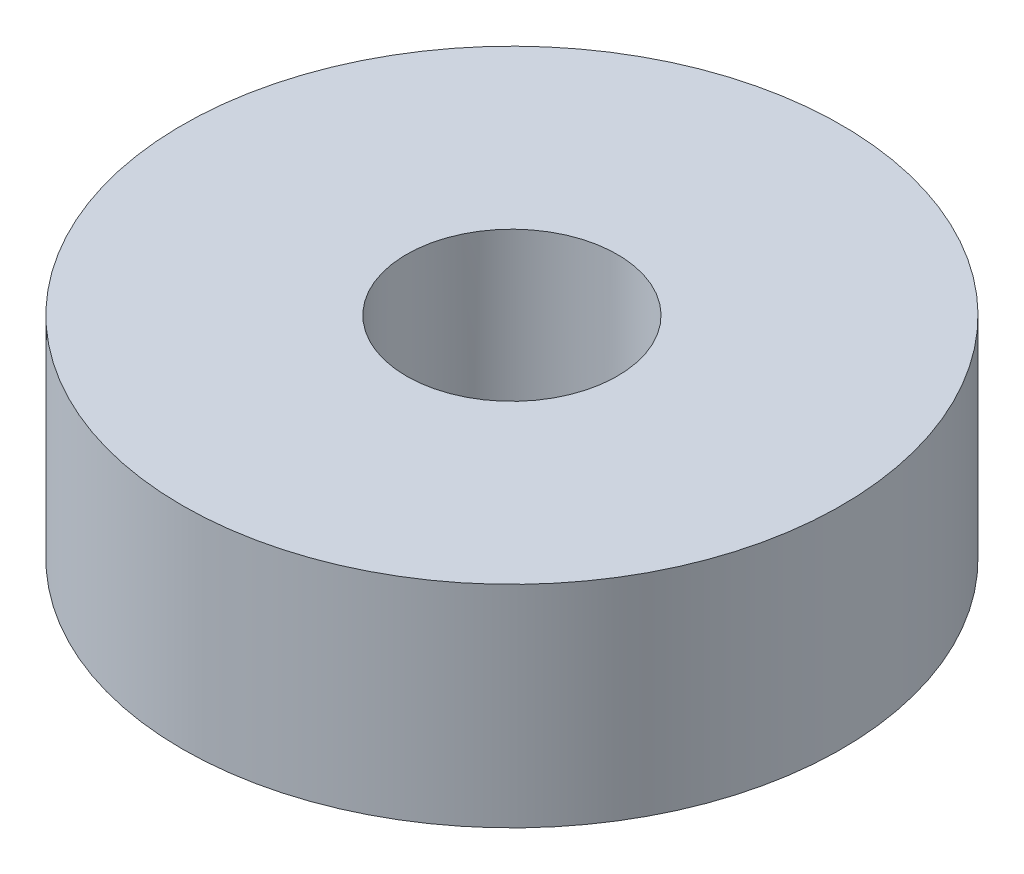
ISO-10303-21;
HEADER;
FILE_DESCRIPTION(('STEP AP214'),'2;1');
FILE_NAME('part.step','',(''),(''),'','','');
FILE_SCHEMA(('AUTOMOTIVE_DESIGN { 1 0 10303 214 1 1 1 1 }'));
ENDSEC;
DATA;
#1=APPLICATION_CONTEXT('core data for automotive mechanical design processes');
#2=APPLICATION_PROTOCOL_DEFINITION('international standard','automotive_design',2000,#1);
#3=PRODUCT_CONTEXT('',#1,'mechanical');
#4=PRODUCT('Part','Part','',(#3));
#5=PRODUCT_RELATED_PRODUCT_CATEGORY('part','',(#4));
#6=PRODUCT_DEFINITION_FORMATION('','',#4);
#7=PRODUCT_DEFINITION_CONTEXT('part definition',#1,'design');
#8=PRODUCT_DEFINITION('design','',#6,#7);
#9=PRODUCT_DEFINITION_SHAPE('','',#8);
#10=(LENGTH_UNIT() NAMED_UNIT(*) SI_UNIT(.MILLI.,.METRE.));
#11=(NAMED_UNIT(*) PLANE_ANGLE_UNIT() SI_UNIT($,.RADIAN.));
#12=(NAMED_UNIT(*) SI_UNIT($,.STERADIAN.) SOLID_ANGLE_UNIT());
#13=UNCERTAINTY_MEASURE_WITH_UNIT(LENGTH_MEASURE(1.E-05),#10,'distance_accuracy_value','');
#14=(GEOMETRIC_REPRESENTATION_CONTEXT(3) GLOBAL_UNCERTAINTY_ASSIGNED_CONTEXT((#13)) GLOBAL_UNIT_ASSIGNED_CONTEXT((#10,
#11,#12)) REPRESENTATION_CONTEXT('',''));
#15=CARTESIAN_POINT('',(0.,0.,0.));
#16=DIRECTION('',(0.,0.,1.));
#17=DIRECTION('',(1.,0.,0.));
#18=AXIS2_PLACEMENT_3D('',#15,#16,#17);
#19=CARTESIAN_POINT('',(0.,-2.,0.));
#20=DIRECTION('',(0.,1.,0.));
#21=DIRECTION('',(0.,0.,1.));
#22=AXIS2_PLACEMENT_3D('',#19,#20,#21);
#23=CYLINDRICAL_SURFACE('',#22,4.);
#24=CARTESIAN_POINT('',(0.,6.,0.));
#25=DIRECTION('',(0.,1.,0.));
#26=DIRECTION('',(0.,0.,1.));
#27=AXIS2_PLACEMENT_3D('',#24,#25,#26);
#28=CIRCLE('',#27,4.);
#29=CARTESIAN_POINT('',(0.,6.,4.));
#30=VERTEX_POINT('',#29);
#31=EDGE_CURVE('E171',#30,#30,#28,.T.);
#32=ORIENTED_EDGE('',*,*,#31,.T.);
#33=EDGE_LOOP('',(#32));
#34=FACE_BOUND('',#33,.T.);
#35=CARTESIAN_POINT('',(0.,0.,0.));
#36=DIRECTION('',(0.,-1.,0.));
#37=DIRECTION('',(0.,0.,-1.));
#38=AXIS2_PLACEMENT_3D('',#35,#36,#37);
#39=CIRCLE('',#38,4.);
#40=CARTESIAN_POINT('',(0.,0.,-4.));
#41=VERTEX_POINT('',#40);
#42=EDGE_CURVE('E49',#41,#41,#39,.F.);
#43=ORIENTED_EDGE('',*,*,#42,.F.);
#44=EDGE_LOOP('',(#43));
#45=FACE_BOUND('',#44,.T.);
#46=ADVANCED_FACE('F45',(#34,#45),#23,.F.);
#47=CARTESIAN_POINT('',(0.,-2.,0.));
#48=DIRECTION('',(0.,1.,0.));
#49=DIRECTION('',(0.,0.,1.));
#50=AXIS2_PLACEMENT_3D('',#47,#48,#49);
#51=CYLINDRICAL_SURFACE('',#50,12.5);
#52=CARTESIAN_POINT('',(0.,-2.,0.));
#53=DIRECTION('',(0.,1.,0.));
#54=DIRECTION('',(0.,0.,1.));
#55=AXIS2_PLACEMENT_3D('',#52,#53,#54);
#56=CIRCLE('',#55,12.5);
#57=CARTESIAN_POINT('',(0.,-2.,12.5));
#58=VERTEX_POINT('',#57);
#59=EDGE_CURVE('E11',#58,#58,#56,.T.);
#60=ORIENTED_EDGE('',*,*,#59,.T.);
#61=EDGE_LOOP('',(#60));
#62=FACE_BOUND('',#61,.T.);
#63=CARTESIAN_POINT('',(0.,6.,0.));
#64=DIRECTION('',(0.,1.,0.));
#65=DIRECTION('',(0.,0.,1.));
#66=AXIS2_PLACEMENT_3D('',#63,#64,#65);
#67=CIRCLE('',#66,12.5);
#68=CARTESIAN_POINT('',(0.,6.,12.5));
#69=VERTEX_POINT('',#68);
#70=EDGE_CURVE('E55',#69,#69,#67,.T.);
#71=ORIENTED_EDGE('',*,*,#70,.F.);
#72=EDGE_LOOP('',(#71));
#73=FACE_BOUND('',#72,.T.);
#74=ADVANCED_FACE('F47',(#62,#73),#51,.T.);
#75=CARTESIAN_POINT('',(0.,-2.,0.));
#76=DIRECTION('',(0.,1.,0.));
#77=DIRECTION('',(0.,0.,1.));
#78=AXIS2_PLACEMENT_3D('',#75,#76,#77);
#79=PLANE('',#78);
#80=DIRECTION('',(-0.500000000000001,0.,0.866025403784438));
#81=VECTOR('',#80,1.);
#82=CARTESIAN_POINT('',(9.85829335034782,-2.,0.));
#83=LINE('',#82,#81);
#84=CARTESIAN_POINT('',(9.85829335034782,-2.,0.));
#85=VERTEX_POINT('',#84);
#86=CARTESIAN_POINT('',(4.92914667517389,-2.,8.53753247936043));
#87=VERTEX_POINT('',#86);
#88=EDGE_CURVE('E143',#85,#87,#83,.T.);
#89=ORIENTED_EDGE('',*,*,#88,.F.);
#90=DIRECTION('',(0.499999999999995,0.,0.866025403784441));
#91=VECTOR('',#90,1.);
#92=CARTESIAN_POINT('',(4.92914667517401,-2.,-8.53753247936036));
#93=LINE('',#92,#91);
#94=CARTESIAN_POINT('',(4.92914667517401,-2.,-8.53753247936036));
#95=VERTEX_POINT('',#94);
#96=EDGE_CURVE('E62',#95,#85,#93,.T.);
#97=ORIENTED_EDGE('',*,*,#96,.F.);
#98=DIRECTION('',(1.,0.,0.));
#99=VECTOR('',#98,1.);
#100=CARTESIAN_POINT('',(-4.92914667517383,-2.,-8.53753247936046));
#101=LINE('',#100,#99);
#102=CARTESIAN_POINT('',(-4.92914667517383,-2.,-8.53753247936046));
#103=VERTEX_POINT('',#102);
#104=EDGE_CURVE('E156',#103,#95,#101,.T.);
#105=ORIENTED_EDGE('',*,*,#104,.F.);
#106=DIRECTION('',(0.500000000000007,0.,-0.866025403784435));
#107=VECTOR('',#106,1.);
#108=CARTESIAN_POINT('',(-9.85829335034782,-2.,0.));
#109=LINE('',#108,#107);
#110=CARTESIAN_POINT('',(-9.85829335034782,-2.,0.));
#111=VERTEX_POINT('',#110);
#112=EDGE_CURVE('E153',#111,#103,#109,.T.);
#113=ORIENTED_EDGE('',*,*,#112,.F.);
#114=DIRECTION('',(-0.499999999999995,0.,-0.866025403784441));
#115=VECTOR('',#114,1.);
#116=CARTESIAN_POINT('',(-4.92914667517395,-2.,8.53753247936039));
#117=LINE('',#116,#115);
#118=CARTESIAN_POINT('',(-4.92914667517395,-2.,8.53753247936039));
#119=VERTEX_POINT('',#118);
#120=EDGE_CURVE('E110',#119,#111,#117,.T.);
#121=ORIENTED_EDGE('',*,*,#120,.F.);
#122=DIRECTION('',(-1.,0.,0.));
#123=VECTOR('',#122,1.);
#124=CARTESIAN_POINT('',(4.92914667517389,-2.,8.53753247936043));
#125=LINE('',#124,#123);
#126=EDGE_CURVE('E147',#87,#119,#125,.T.);
#127=ORIENTED_EDGE('',*,*,#126,.F.);
#128=EDGE_LOOP('',(#89,#97,#105,#113,#121,#127));
#129=FACE_BOUND('',#128,.T.);
#130=ORIENTED_EDGE('',*,*,#59,.F.);
#131=EDGE_LOOP('',(#130));
#132=FACE_BOUND('',#131,.T.);
#133=ADVANCED_FACE('F183',(#129,#132),#79,.F.);
#134=CARTESIAN_POINT('',(0.,6.,0.));
#135=DIRECTION('',(0.,1.,0.));
#136=DIRECTION('',(0.,0.,1.));
#137=AXIS2_PLACEMENT_3D('',#134,#135,#136);
#138=PLANE('',#137);
#139=ORIENTED_EDGE('',*,*,#70,.T.);
#140=EDGE_LOOP('',(#139));
#141=FACE_BOUND('',#140,.T.);
#142=ORIENTED_EDGE('',*,*,#31,.F.);
#143=EDGE_LOOP('',(#142));
#144=FACE_BOUND('',#143,.T.);
#145=ADVANCED_FACE('F179',(#141,#144),#138,.T.);
#146=CARTESIAN_POINT('',(0.,0.,0.));
#147=DIRECTION('',(0.,-1.,0.));
#148=DIRECTION('',(0.,0.,-1.));
#149=AXIS2_PLACEMENT_3D('',#146,#147,#148);
#150=PLANE('',#149);
#151=DIRECTION('',(0.499999999999995,0.,0.866025403784441));
#152=VECTOR('',#151,1.);
#153=CARTESIAN_POINT('',(4.92914667517401,0.,-8.53753247936036));
#154=LINE('',#153,#152);
#155=CARTESIAN_POINT('',(4.92914667517401,0.,-8.53753247936036));
#156=VERTEX_POINT('',#155);
#157=CARTESIAN_POINT('',(9.85829335034782,0.,0.));
#158=VERTEX_POINT('',#157);
#159=EDGE_CURVE('E159',#156,#158,#154,.T.);
#160=ORIENTED_EDGE('',*,*,#159,.T.);
#161=DIRECTION('',(-0.500000000000001,0.,0.866025403784438));
#162=VECTOR('',#161,1.);
#163=CARTESIAN_POINT('',(9.85829335034782,0.,0.));
#164=LINE('',#163,#162);
#165=CARTESIAN_POINT('',(4.92914667517389,0.,8.53753247936043));
#166=VERTEX_POINT('',#165);
#167=EDGE_CURVE('E135',#158,#166,#164,.T.);
#168=ORIENTED_EDGE('',*,*,#167,.T.);
#169=DIRECTION('',(-1.,0.,0.));
#170=VECTOR('',#169,1.);
#171=CARTESIAN_POINT('',(4.92914667517389,0.,8.53753247936043));
#172=LINE('',#171,#170);
#173=CARTESIAN_POINT('',(-4.92914667517395,0.,8.53753247936039));
#174=VERTEX_POINT('',#173);
#175=EDGE_CURVE('E131',#166,#174,#172,.T.);
#176=ORIENTED_EDGE('',*,*,#175,.T.);
#177=DIRECTION('',(-0.499999999999995,0.,-0.866025403784441));
#178=VECTOR('',#177,1.);
#179=CARTESIAN_POINT('',(-4.92914667517395,0.,8.53753247936039));
#180=LINE('',#179,#178);
#181=CARTESIAN_POINT('',(-9.85829335034782,0.,0.));
#182=VERTEX_POINT('',#181);
#183=EDGE_CURVE('E107',#174,#182,#180,.T.);
#184=ORIENTED_EDGE('',*,*,#183,.T.);
#185=DIRECTION('',(0.500000000000007,0.,-0.866025403784435));
#186=VECTOR('',#185,1.);
#187=CARTESIAN_POINT('',(-9.85829335034782,0.,0.));
#188=LINE('',#187,#186);
#189=CARTESIAN_POINT('',(-4.92914667517383,0.,-8.53753247936046));
#190=VERTEX_POINT('',#189);
#191=EDGE_CURVE('E119',#182,#190,#188,.T.);
#192=ORIENTED_EDGE('',*,*,#191,.T.);
#193=DIRECTION('',(1.,0.,0.));
#194=VECTOR('',#193,1.);
#195=CARTESIAN_POINT('',(-4.92914667517383,0.,-8.53753247936046));
#196=LINE('',#195,#194);
#197=EDGE_CURVE('E124',#190,#156,#196,.T.);
#198=ORIENTED_EDGE('',*,*,#197,.T.);
#199=EDGE_LOOP('',(#160,#168,#176,#184,#192,#198));
#200=FACE_BOUND('',#199,.T.);
#201=ORIENTED_EDGE('',*,*,#42,.T.);
#202=EDGE_LOOP('',(#201));
#203=FACE_BOUND('',#202,.T.);
#204=ADVANCED_FACE('F127',(#200,#203),#150,.T.);
#205=CARTESIAN_POINT('',(4.92914667517401,0.,-8.53753247936036));
#206=DIRECTION('',(0.866025403784441,0.,-0.499999999999995));
#207=DIRECTION('',(-0.499999999999995,0.,-0.866025403784442));
#208=AXIS2_PLACEMENT_3D('',#205,#206,#207);
#209=PLANE('',#208);
#210=ORIENTED_EDGE('',*,*,#96,.T.);
#211=DIRECTION('',(0.,-1.,0.));
#212=VECTOR('',#211,1.);
#213=CARTESIAN_POINT('',(9.85829335034782,0.,0.));
#214=LINE('',#213,#212);
#215=EDGE_CURVE('E92',#158,#85,#214,.T.);
#216=ORIENTED_EDGE('',*,*,#215,.F.);
#217=ORIENTED_EDGE('',*,*,#159,.F.);
#218=DIRECTION('',(0.,-1.,0.));
#219=VECTOR('',#218,1.);
#220=CARTESIAN_POINT('',(4.92914667517401,0.,-8.53753247936036));
#221=LINE('',#220,#219);
#222=EDGE_CURVE('E70',#156,#95,#221,.T.);
#223=ORIENTED_EDGE('',*,*,#222,.T.);
#224=EDGE_LOOP('',(#210,#216,#217,#223));
#225=FACE_BOUND('',#224,.T.);
#226=ADVANCED_FACE('F200',(#225),#209,.F.);
#227=CARTESIAN_POINT('',(-4.92914667517383,0.,-8.53753247936046));
#228=DIRECTION('',(0.,0.,-1.));
#229=DIRECTION('',(-1.,0.,0.));
#230=AXIS2_PLACEMENT_3D('',#227,#228,#229);
#231=PLANE('',#230);
#232=ORIENTED_EDGE('',*,*,#104,.T.);
#233=ORIENTED_EDGE('',*,*,#222,.F.);
#234=ORIENTED_EDGE('',*,*,#197,.F.);
#235=DIRECTION('',(0.,-1.,0.));
#236=VECTOR('',#235,1.);
#237=CARTESIAN_POINT('',(-4.92914667517383,0.,-8.53753247936046));
#238=LINE('',#237,#236);
#239=EDGE_CURVE('E115',#190,#103,#238,.T.);
#240=ORIENTED_EDGE('',*,*,#239,.T.);
#241=EDGE_LOOP('',(#232,#233,#234,#240));
#242=FACE_BOUND('',#241,.T.);
#243=ADVANCED_FACE('F203',(#242),#231,.F.);
#244=CARTESIAN_POINT('',(-9.85829335034782,0.,0.));
#245=DIRECTION('',(-0.866025403784435,0.,-0.500000000000007));
#246=DIRECTION('',(-0.500000000000007,0.,0.866025403784435));
#247=AXIS2_PLACEMENT_3D('',#244,#245,#246);
#248=PLANE('',#247);
#249=ORIENTED_EDGE('',*,*,#112,.T.);
#250=ORIENTED_EDGE('',*,*,#239,.F.);
#251=ORIENTED_EDGE('',*,*,#191,.F.);
#252=DIRECTION('',(0.,-1.,0.));
#253=VECTOR('',#252,1.);
#254=CARTESIAN_POINT('',(-9.85829335034782,0.,0.));
#255=LINE('',#254,#253);
#256=EDGE_CURVE('E103',#182,#111,#255,.T.);
#257=ORIENTED_EDGE('',*,*,#256,.T.);
#258=EDGE_LOOP('',(#249,#250,#251,#257));
#259=FACE_BOUND('',#258,.T.);
#260=ADVANCED_FACE('F120',(#259),#248,.F.);
#261=CARTESIAN_POINT('',(-4.92914667517395,0.,8.53753247936039));
#262=DIRECTION('',(-0.866025403784442,0.,0.499999999999995));
#263=DIRECTION('',(0.499999999999995,0.,0.866025403784441));
#264=AXIS2_PLACEMENT_3D('',#261,#262,#263);
#265=PLANE('',#264);
#266=ORIENTED_EDGE('',*,*,#120,.T.);
#267=ORIENTED_EDGE('',*,*,#256,.F.);
#268=ORIENTED_EDGE('',*,*,#183,.F.);
#269=DIRECTION('',(0.,-1.,0.));
#270=VECTOR('',#269,1.);
#271=CARTESIAN_POINT('',(-4.92914667517395,0.,8.53753247936039));
#272=LINE('',#271,#270);
#273=EDGE_CURVE('E116',#174,#119,#272,.T.);
#274=ORIENTED_EDGE('',*,*,#273,.T.);
#275=EDGE_LOOP('',(#266,#267,#268,#274));
#276=FACE_BOUND('',#275,.T.);
#277=ADVANCED_FACE('F105',(#276),#265,.F.);
#278=CARTESIAN_POINT('',(4.92914667517389,0.,8.53753247936043));
#279=DIRECTION('',(0.,0.,1.));
#280=DIRECTION('',(1.,0.,0.));
#281=AXIS2_PLACEMENT_3D('',#278,#279,#280);
#282=PLANE('',#281);
#283=ORIENTED_EDGE('',*,*,#126,.T.);
#284=ORIENTED_EDGE('',*,*,#273,.F.);
#285=ORIENTED_EDGE('',*,*,#175,.F.);
#286=DIRECTION('',(0.,-1.,0.));
#287=VECTOR('',#286,1.);
#288=CARTESIAN_POINT('',(4.92914667517389,0.,8.53753247936043));
#289=LINE('',#288,#287);
#290=EDGE_CURVE('E166',#166,#87,#289,.T.);
#291=ORIENTED_EDGE('',*,*,#290,.T.);
#292=EDGE_LOOP('',(#283,#284,#285,#291));
#293=FACE_BOUND('',#292,.T.);
#294=ADVANCED_FACE('F207',(#293),#282,.F.);
#295=CARTESIAN_POINT('',(9.85829335034782,0.,0.));
#296=DIRECTION('',(0.866025403784438,0.,0.500000000000001));
#297=DIRECTION('',(0.500000000000001,0.,-0.866025403784438));
#298=AXIS2_PLACEMENT_3D('',#295,#296,#297);
#299=PLANE('',#298);
#300=ORIENTED_EDGE('',*,*,#88,.T.);
#301=ORIENTED_EDGE('',*,*,#290,.F.);
#302=ORIENTED_EDGE('',*,*,#167,.F.);
#303=ORIENTED_EDGE('',*,*,#215,.T.);
#304=EDGE_LOOP('',(#300,#301,#302,#303));
#305=FACE_BOUND('',#304,.T.);
#306=ADVANCED_FACE('F204',(#305),#299,.F.);
#307=CLOSED_SHELL('',(#46,#74,#133,#145,#204,#226,#243,#260,#277,#294,#306));
#308=MANIFOLD_SOLID_BREP('B2',#307);
#309=ADVANCED_BREP_SHAPE_REPRESENTATION('',(#18,#308),#14);
#310=SHAPE_DEFINITION_REPRESENTATION(#9,#309);
ENDSEC;
END-ISO-10303-21;
